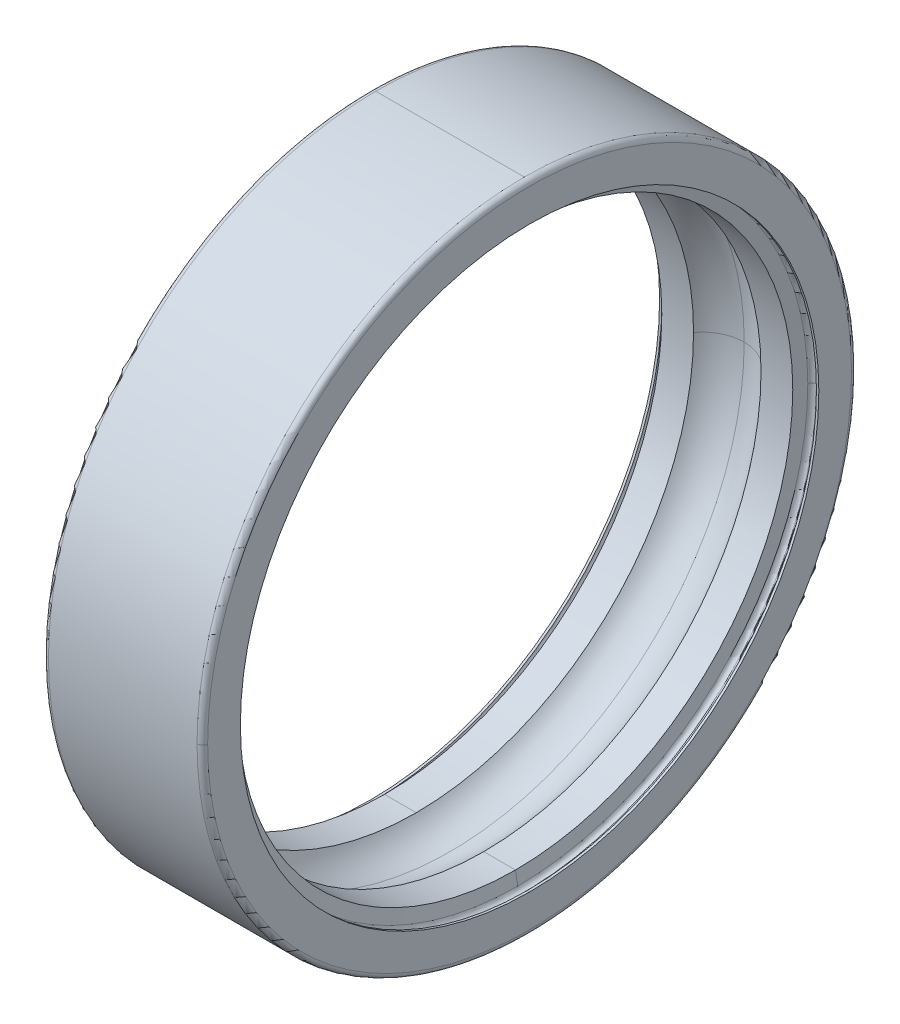
ISO-10303-21;
HEADER;
FILE_DESCRIPTION(('STEP AP214'),'2;1');
FILE_NAME('part.step','',(''),(''),'','','');
FILE_SCHEMA(('AUTOMOTIVE_DESIGN { 1 0 10303 214 1 1 1 1 }'));
ENDSEC;
DATA;
#1=APPLICATION_CONTEXT('core data for automotive mechanical design processes');
#2=APPLICATION_PROTOCOL_DEFINITION('international standard','automotive_design',2000,#1);
#3=PRODUCT_CONTEXT('',#1,'mechanical');
#4=PRODUCT('Part','Part','',(#3));
#5=PRODUCT_RELATED_PRODUCT_CATEGORY('part','',(#4));
#6=PRODUCT_DEFINITION_FORMATION('','',#4);
#7=PRODUCT_DEFINITION_CONTEXT('part definition',#1,'design');
#8=PRODUCT_DEFINITION('design','',#6,#7);
#9=PRODUCT_DEFINITION_SHAPE('','',#8);
#10=(LENGTH_UNIT() NAMED_UNIT(*) SI_UNIT(.MILLI.,.METRE.));
#11=(NAMED_UNIT(*) PLANE_ANGLE_UNIT() SI_UNIT($,.RADIAN.));
#12=(NAMED_UNIT(*) SI_UNIT($,.STERADIAN.) SOLID_ANGLE_UNIT());
#13=UNCERTAINTY_MEASURE_WITH_UNIT(LENGTH_MEASURE(1.E-05),#10,'distance_accuracy_value','');
#14=(GEOMETRIC_REPRESENTATION_CONTEXT(3) GLOBAL_UNCERTAINTY_ASSIGNED_CONTEXT((#13)) GLOBAL_UNIT_ASSIGNED_CONTEXT((#10,
#11,#12)) REPRESENTATION_CONTEXT('',''));
#15=CARTESIAN_POINT('',(0.,0.,0.));
#16=DIRECTION('',(0.,0.,1.));
#17=DIRECTION('',(1.,0.,0.));
#18=AXIS2_PLACEMENT_3D('',#15,#16,#17);
#19=CARTESIAN_POINT('',(8.595,0.,0.));
#20=DIRECTION('',(1.,0.,0.));
#21=DIRECTION('',(0.,0.,-1.));
#22=AXIS2_PLACEMENT_3D('',#19,#20,#21);
#23=TOROIDAL_SURFACE('',#22,16.35,0.27);
#24=CARTESIAN_POINT('',(8.595,0.,0.));
#25=DIRECTION('',(1.,0.,0.));
#26=DIRECTION('',(0.,0.,1.));
#27=AXIS2_PLACEMENT_3D('',#24,#25,#26);
#28=CIRCLE('',#27,16.62);
#29=CARTESIAN_POINT('',(8.595,0.,-16.62));
#30=VERTEX_POINT('',#29);
#31=CARTESIAN_POINT('',(8.595,0.,16.62));
#32=VERTEX_POINT('',#31);
#33=EDGE_CURVE('E445',#30,#32,#28,.T.);
#34=ORIENTED_EDGE('',*,*,#33,.T.);
#35=CARTESIAN_POINT('',(8.595,0.,16.35));
#36=DIRECTION('',(0.,-1.,0.));
#37=DIRECTION('',(0.,0.,1.));
#38=AXIS2_PLACEMENT_3D('',#35,#36,#37);
#39=CIRCLE('',#38,0.27);
#40=CARTESIAN_POINT('',(8.3291019066867,0.,16.3968850079701));
#41=VERTEX_POINT('',#40);
#42=EDGE_CURVE('E342',#32,#41,#39,.T.);
#43=ORIENTED_EDGE('',*,*,#42,.T.);
#44=CARTESIAN_POINT('',(8.3291019066867,0.,0.));
#45=DIRECTION('',(1.,0.,0.));
#46=DIRECTION('',(0.,1.,0.));
#47=AXIS2_PLACEMENT_3D('',#44,#45,#46);
#48=CIRCLE('',#47,16.3968850079701);
#49=CARTESIAN_POINT('',(8.3291019066867,16.3968850079701,0.));
#50=VERTEX_POINT('',#49);
#51=EDGE_CURVE('E32',#50,#41,#48,.T.);
#52=ORIENTED_EDGE('',*,*,#51,.F.);
#53=CARTESIAN_POINT('',(8.3291019066867,0.,0.));
#54=DIRECTION('',(1.,0.,0.));
#55=DIRECTION('',(0.,1.,0.));
#56=AXIS2_PLACEMENT_3D('',#53,#54,#55);
#57=CIRCLE('',#56,16.3968850079701);
#58=CARTESIAN_POINT('',(8.3291019066867,0.,-16.3968850079701));
#59=VERTEX_POINT('',#58);
#60=EDGE_CURVE('E188',#59,#50,#57,.T.);
#61=ORIENTED_EDGE('',*,*,#60,.F.);
#62=CARTESIAN_POINT('',(8.595,0.,-16.35));
#63=DIRECTION('',(0.,-1.,0.));
#64=DIRECTION('',(0.,0.,-1.));
#65=AXIS2_PLACEMENT_3D('',#62,#63,#64);
#66=CIRCLE('',#65,0.27);
#67=EDGE_CURVE('E328',#59,#30,#66,.T.);
#68=ORIENTED_EDGE('',*,*,#67,.T.);
#69=EDGE_LOOP('',(#34,#43,#52,#61,#68));
#70=FACE_BOUND('',#69,.T.);
#71=ADVANCED_FACE('F17',(#70),#23,.F.);
#72=CARTESIAN_POINT('',(8.9325,0.,0.));
#73=DIRECTION('',(1.,0.,0.));
#74=DIRECTION('',(0.,1.,0.));
#75=AXIS2_PLACEMENT_3D('',#72,#73,#74);
#76=CYLINDRICAL_SURFACE('',#75,16.35);
#77=DIRECTION('',(1.,0.,0.));
#78=VECTOR('',#77,1.);
#79=CARTESIAN_POINT('',(8.9325,16.35,0.));
#80=LINE('',#79,#78);
#81=CARTESIAN_POINT('',(8.865,16.35,0.));
#82=VERTEX_POINT('',#81);
#83=CARTESIAN_POINT('',(9.,16.35,0.));
#84=VERTEX_POINT('',#83);
#85=EDGE_CURVE('E344',#82,#84,#80,.T.);
#86=ORIENTED_EDGE('',*,*,#85,.T.);
#87=CARTESIAN_POINT('',(9.,0.,0.));
#88=DIRECTION('',(1.,0.,0.));
#89=DIRECTION('',(0.,1.,0.));
#90=AXIS2_PLACEMENT_3D('',#87,#88,#89);
#91=CIRCLE('',#90,16.35);
#92=CARTESIAN_POINT('',(9.,-16.35,0.));
#93=VERTEX_POINT('',#92);
#94=EDGE_CURVE('E11',#84,#93,#91,.T.);
#95=ORIENTED_EDGE('',*,*,#94,.T.);
#96=DIRECTION('',(-1.,0.,0.));
#97=VECTOR('',#96,1.);
#98=CARTESIAN_POINT('',(8.9325,-16.35,0.));
#99=LINE('',#98,#97);
#100=CARTESIAN_POINT('',(8.865,-16.35,0.));
#101=VERTEX_POINT('',#100);
#102=EDGE_CURVE('E225',#93,#101,#99,.T.);
#103=ORIENTED_EDGE('',*,*,#102,.T.);
#104=CARTESIAN_POINT('',(8.865,0.,0.));
#105=DIRECTION('',(1.,0.,0.));
#106=DIRECTION('',(0.,1.,0.));
#107=AXIS2_PLACEMENT_3D('',#104,#105,#106);
#108=CIRCLE('',#107,16.35);
#109=CARTESIAN_POINT('',(8.865,0.,16.35));
#110=VERTEX_POINT('',#109);
#111=EDGE_CURVE('E322',#110,#101,#108,.T.);
#112=ORIENTED_EDGE('',*,*,#111,.F.);
#113=CARTESIAN_POINT('',(8.865,0.,0.));
#114=DIRECTION('',(1.,0.,0.));
#115=DIRECTION('',(0.,1.,0.));
#116=AXIS2_PLACEMENT_3D('',#113,#114,#115);
#117=CIRCLE('',#116,16.35);
#118=EDGE_CURVE('E378',#82,#110,#117,.T.);
#119=ORIENTED_EDGE('',*,*,#118,.F.);
#120=EDGE_LOOP('',(#86,#95,#103,#112,#119));
#121=FACE_BOUND('',#120,.T.);
#122=ADVANCED_FACE('F19',(#121),#76,.F.);
#123=CARTESIAN_POINT('',(9.,17.275,0.));
#124=DIRECTION('',(1.,0.,0.));
#125=DIRECTION('',(0.,1.,0.));
#126=AXIS2_PLACEMENT_3D('',#123,#124,#125);
#127=PLANE('',#126);
#128=ORIENTED_EDGE('',*,*,#94,.F.);
#129=CARTESIAN_POINT('',(9.,0.,0.));
#130=DIRECTION('',(1.,0.,0.));
#131=DIRECTION('',(0.,1.,0.));
#132=AXIS2_PLACEMENT_3D('',#129,#130,#131);
#133=CIRCLE('',#132,16.35);
#134=EDGE_CURVE('E220',#93,#84,#133,.T.);
#135=ORIENTED_EDGE('',*,*,#134,.F.);
#136=EDGE_LOOP('',(#128,#135));
#137=FACE_BOUND('',#136,.T.);
#138=CARTESIAN_POINT('',(9.,0.,0.));
#139=DIRECTION('',(1.,0.,0.));
#140=DIRECTION('',(0.,1.,0.));
#141=AXIS2_PLACEMENT_3D('',#138,#139,#140);
#142=CIRCLE('',#141,18.2);
#143=CARTESIAN_POINT('',(9.,0.,18.2));
#144=VERTEX_POINT('',#143);
#145=CARTESIAN_POINT('',(9.,0.,-18.2));
#146=VERTEX_POINT('',#145);
#147=EDGE_CURVE('E25',#144,#146,#142,.T.);
#148=ORIENTED_EDGE('',*,*,#147,.T.);
#149=CARTESIAN_POINT('',(9.,0.,0.));
#150=DIRECTION('',(1.,0.,0.));
#151=DIRECTION('',(0.,1.,0.));
#152=AXIS2_PLACEMENT_3D('',#149,#150,#151);
#153=CIRCLE('',#152,18.2);
#154=EDGE_CURVE('E200',#146,#144,#153,.T.);
#155=ORIENTED_EDGE('',*,*,#154,.T.);
#156=EDGE_LOOP('',(#148,#155));
#157=FACE_BOUND('',#156,.T.);
#158=ADVANCED_FACE('F199',(#137,#157),#127,.T.);
#159=CARTESIAN_POINT('',(8.7,0.,0.));
#160=DIRECTION('',(1.,0.,0.));
#161=DIRECTION('',(0.,0.,-1.));
#162=AXIS2_PLACEMENT_3D('',#159,#160,#161);
#163=TOROIDAL_SURFACE('',#162,18.2,0.3);
#164=CARTESIAN_POINT('',(8.7,0.,-18.2));
#165=DIRECTION('',(0.,-1.,0.));
#166=DIRECTION('',(0.,0.,-1.));
#167=AXIS2_PLACEMENT_3D('',#164,#165,#166);
#168=CIRCLE('',#167,0.3);
#169=CARTESIAN_POINT('',(8.7,0.,-18.5));
#170=VERTEX_POINT('',#169);
#171=EDGE_CURVE('E211',#170,#146,#168,.T.);
#172=ORIENTED_EDGE('',*,*,#171,.T.);
#173=ORIENTED_EDGE('',*,*,#147,.F.);
#174=CARTESIAN_POINT('',(8.7,0.,18.2));
#175=DIRECTION('',(0.,-1.,0.));
#176=DIRECTION('',(0.,0.,1.));
#177=AXIS2_PLACEMENT_3D('',#174,#175,#176);
#178=CIRCLE('',#177,0.3);
#179=CARTESIAN_POINT('',(8.7,0.,18.5));
#180=VERTEX_POINT('',#179);
#181=EDGE_CURVE('E213',#144,#180,#178,.T.);
#182=ORIENTED_EDGE('',*,*,#181,.T.);
#183=CARTESIAN_POINT('',(8.7,0.,0.));
#184=DIRECTION('',(1.,0.,0.));
#185=DIRECTION('',(0.,1.,0.));
#186=AXIS2_PLACEMENT_3D('',#183,#184,#185);
#187=CIRCLE('',#186,18.5);
#188=CARTESIAN_POINT('',(8.7,-18.5,0.));
#189=VERTEX_POINT('',#188);
#190=EDGE_CURVE('E233',#180,#189,#187,.T.);
#191=ORIENTED_EDGE('',*,*,#190,.T.);
#192=CARTESIAN_POINT('',(8.7,0.,0.));
#193=DIRECTION('',(1.,0.,0.));
#194=DIRECTION('',(0.,1.,0.));
#195=AXIS2_PLACEMENT_3D('',#192,#193,#194);
#196=CIRCLE('',#195,18.5);
#197=EDGE_CURVE('E193',#189,#170,#196,.T.);
#198=ORIENTED_EDGE('',*,*,#197,.T.);
#199=EDGE_LOOP('',(#172,#173,#182,#191,#198));
#200=FACE_BOUND('',#199,.T.);
#201=ADVANCED_FACE('F216',(#200),#163,.T.);
#202=CARTESIAN_POINT('',(4.5,0.,0.));
#203=DIRECTION('',(1.,0.,0.));
#204=DIRECTION('',(0.,1.,0.));
#205=AXIS2_PLACEMENT_3D('',#202,#203,#204);
#206=CYLINDRICAL_SURFACE('',#205,18.5);
#207=DIRECTION('',(1.,0.,0.));
#208=VECTOR('',#207,1.);
#209=CARTESIAN_POINT('',(4.5,18.5,0.));
#210=LINE('',#209,#208);
#211=CARTESIAN_POINT('',(0.3,18.5,0.));
#212=VERTEX_POINT('',#211);
#213=CARTESIAN_POINT('',(8.7,18.5,0.));
#214=VERTEX_POINT('',#213);
#215=EDGE_CURVE('E214',#212,#214,#210,.T.);
#216=ORIENTED_EDGE('',*,*,#215,.T.);
#217=CARTESIAN_POINT('',(8.7,0.,0.));
#218=DIRECTION('',(1.,0.,0.));
#219=DIRECTION('',(0.,1.,0.));
#220=AXIS2_PLACEMENT_3D('',#217,#218,#219);
#221=CIRCLE('',#220,18.5);
#222=EDGE_CURVE('E219',#170,#214,#221,.T.);
#223=ORIENTED_EDGE('',*,*,#222,.F.);
#224=ORIENTED_EDGE('',*,*,#197,.F.);
#225=DIRECTION('',(-1.,0.,0.));
#226=VECTOR('',#225,1.);
#227=CARTESIAN_POINT('',(4.5,-18.5,0.));
#228=LINE('',#227,#226);
#229=CARTESIAN_POINT('',(0.3,-18.5,0.));
#230=VERTEX_POINT('',#229);
#231=EDGE_CURVE('E455',#189,#230,#228,.T.);
#232=ORIENTED_EDGE('',*,*,#231,.T.);
#233=CARTESIAN_POINT('',(0.3,0.,0.));
#234=DIRECTION('',(1.,0.,0.));
#235=DIRECTION('',(0.,1.,0.));
#236=AXIS2_PLACEMENT_3D('',#233,#234,#235);
#237=CIRCLE('',#236,18.5);
#238=CARTESIAN_POINT('',(0.3,0.,-18.5));
#239=VERTEX_POINT('',#238);
#240=EDGE_CURVE('E191',#230,#239,#237,.T.);
#241=ORIENTED_EDGE('',*,*,#240,.T.);
#242=CARTESIAN_POINT('',(0.3,0.,0.));
#243=DIRECTION('',(1.,0.,0.));
#244=DIRECTION('',(0.,1.,0.));
#245=AXIS2_PLACEMENT_3D('',#242,#243,#244);
#246=CIRCLE('',#245,18.5);
#247=EDGE_CURVE('E241',#239,#212,#246,.T.);
#248=ORIENTED_EDGE('',*,*,#247,.T.);
#249=EDGE_LOOP('',(#216,#223,#224,#232,#241,#248));
#250=FACE_BOUND('',#249,.T.);
#251=ADVANCED_FACE('F472',(#250),#206,.T.);
#252=CARTESIAN_POINT('',(0.3,0.,0.));
#253=DIRECTION('',(1.,0.,0.));
#254=DIRECTION('',(0.,0.,-1.));
#255=AXIS2_PLACEMENT_3D('',#252,#253,#254);
#256=TOROIDAL_SURFACE('',#255,18.2,0.3);
#257=CARTESIAN_POINT('',(0.3,0.,-18.2));
#258=DIRECTION('',(0.,-1.,0.));
#259=DIRECTION('',(0.,0.,-1.));
#260=AXIS2_PLACEMENT_3D('',#257,#258,#259);
#261=CIRCLE('',#260,0.3);
#262=CARTESIAN_POINT('',(0.,0.,-18.2));
#263=VERTEX_POINT('',#262);
#264=EDGE_CURVE('E229',#263,#239,#261,.T.);
#265=ORIENTED_EDGE('',*,*,#264,.T.);
#266=ORIENTED_EDGE('',*,*,#240,.F.);
#267=CARTESIAN_POINT('',(0.3,0.,0.));
#268=DIRECTION('',(1.,0.,0.));
#269=DIRECTION('',(0.,1.,0.));
#270=AXIS2_PLACEMENT_3D('',#267,#268,#269);
#271=CIRCLE('',#270,18.5);
#272=CARTESIAN_POINT('',(0.3,0.,18.5));
#273=VERTEX_POINT('',#272);
#274=EDGE_CURVE('E389',#273,#230,#271,.T.);
#275=ORIENTED_EDGE('',*,*,#274,.F.);
#276=CARTESIAN_POINT('',(0.3,0.,18.2));
#277=DIRECTION('',(0.,-1.,0.));
#278=DIRECTION('',(0.,0.,1.));
#279=AXIS2_PLACEMENT_3D('',#276,#277,#278);
#280=CIRCLE('',#279,0.3);
#281=CARTESIAN_POINT('',(0.,0.,18.2));
#282=VERTEX_POINT('',#281);
#283=EDGE_CURVE('E238',#273,#282,#280,.T.);
#284=ORIENTED_EDGE('',*,*,#283,.T.);
#285=CARTESIAN_POINT('',(0.,0.,0.));
#286=DIRECTION('',(1.,0.,0.));
#287=DIRECTION('',(0.,1.,0.));
#288=AXIS2_PLACEMENT_3D('',#285,#286,#287);
#289=CIRCLE('',#288,18.2);
#290=EDGE_CURVE('E194',#282,#263,#289,.T.);
#291=ORIENTED_EDGE('',*,*,#290,.T.);
#292=EDGE_LOOP('',(#265,#266,#275,#284,#291));
#293=FACE_BOUND('',#292,.T.);
#294=ADVANCED_FACE('F468',(#293),#256,.T.);
#295=CARTESIAN_POINT('',(0.,17.275,0.));
#296=DIRECTION('',(-1.,0.,0.));
#297=DIRECTION('',(0.,0.,1.));
#298=AXIS2_PLACEMENT_3D('',#295,#296,#297);
#299=PLANE('',#298);
#300=CARTESIAN_POINT('',(0.,0.,0.));
#301=DIRECTION('',(1.,0.,0.));
#302=DIRECTION('',(0.,1.,0.));
#303=AXIS2_PLACEMENT_3D('',#300,#301,#302);
#304=CIRCLE('',#303,16.35);
#305=CARTESIAN_POINT('',(0.,16.35,0.));
#306=VERTEX_POINT('',#305);
#307=CARTESIAN_POINT('',(0.,-16.35,0.));
#308=VERTEX_POINT('',#307);
#309=EDGE_CURVE('E243',#306,#308,#304,.T.);
#310=ORIENTED_EDGE('',*,*,#309,.T.);
#311=CARTESIAN_POINT('',(0.,0.,0.));
#312=DIRECTION('',(1.,0.,0.));
#313=DIRECTION('',(0.,1.,0.));
#314=AXIS2_PLACEMENT_3D('',#311,#312,#313);
#315=CIRCLE('',#314,16.35);
#316=EDGE_CURVE('E249',#308,#306,#315,.T.);
#317=ORIENTED_EDGE('',*,*,#316,.T.);
#318=EDGE_LOOP('',(#310,#317));
#319=FACE_BOUND('',#318,.T.);
#320=CARTESIAN_POINT('',(0.,0.,0.));
#321=DIRECTION('',(1.,0.,0.));
#322=DIRECTION('',(0.,1.,0.));
#323=AXIS2_PLACEMENT_3D('',#320,#321,#322);
#324=CIRCLE('',#323,18.2);
#325=EDGE_CURVE('E232',#263,#282,#324,.T.);
#326=ORIENTED_EDGE('',*,*,#325,.F.);
#327=ORIENTED_EDGE('',*,*,#290,.F.);
#328=EDGE_LOOP('',(#326,#327));
#329=FACE_BOUND('',#328,.T.);
#330=ADVANCED_FACE('F478',(#319,#329),#299,.T.);
#331=CARTESIAN_POINT('',(0.067499999999999,0.,0.));
#332=DIRECTION('',(1.,0.,0.));
#333=DIRECTION('',(0.,1.,0.));
#334=AXIS2_PLACEMENT_3D('',#331,#332,#333);
#335=CYLINDRICAL_SURFACE('',#334,16.35);
#336=DIRECTION('',(1.,0.,0.));
#337=VECTOR('',#336,1.);
#338=CARTESIAN_POINT('',(0.067499999999999,16.35,0.));
#339=LINE('',#338,#337);
#340=CARTESIAN_POINT('',(0.135,16.35,0.));
#341=VERTEX_POINT('',#340);
#342=EDGE_CURVE('E245',#306,#341,#339,.T.);
#343=ORIENTED_EDGE('',*,*,#342,.T.);
#344=CARTESIAN_POINT('',(0.135,0.,0.));
#345=DIRECTION('',(1.,0.,0.));
#346=DIRECTION('',(0.,1.,0.));
#347=AXIS2_PLACEMENT_3D('',#344,#345,#346);
#348=CIRCLE('',#347,16.35);
#349=CARTESIAN_POINT('',(0.135,0.,16.35));
#350=VERTEX_POINT('',#349);
#351=EDGE_CURVE('E235',#341,#350,#348,.T.);
#352=ORIENTED_EDGE('',*,*,#351,.T.);
#353=CARTESIAN_POINT('',(0.135,0.,0.));
#354=DIRECTION('',(1.,0.,0.));
#355=DIRECTION('',(0.,1.,0.));
#356=AXIS2_PLACEMENT_3D('',#353,#354,#355);
#357=CIRCLE('',#356,16.35);
#358=CARTESIAN_POINT('',(0.135,-16.35,0.));
#359=VERTEX_POINT('',#358);
#360=EDGE_CURVE('E260',#350,#359,#357,.T.);
#361=ORIENTED_EDGE('',*,*,#360,.T.);
#362=DIRECTION('',(-1.,0.,0.));
#363=VECTOR('',#362,1.);
#364=CARTESIAN_POINT('',(0.067499999999999,-16.35,0.));
#365=LINE('',#364,#363);
#366=EDGE_CURVE('E254',#359,#308,#365,.T.);
#367=ORIENTED_EDGE('',*,*,#366,.T.);
#368=ORIENTED_EDGE('',*,*,#309,.F.);
#369=EDGE_LOOP('',(#343,#352,#361,#367,#368));
#370=FACE_BOUND('',#369,.T.);
#371=ADVANCED_FACE('F480',(#370),#335,.F.);
#372=CARTESIAN_POINT('',(0.405,0.,0.));
#373=DIRECTION('',(1.,0.,0.));
#374=DIRECTION('',(0.,0.,-1.));
#375=AXIS2_PLACEMENT_3D('',#372,#373,#374);
#376=TOROIDAL_SURFACE('',#375,16.35,0.27);
#377=CARTESIAN_POINT('',(0.405,0.,0.));
#378=DIRECTION('',(1.,0.,0.));
#379=DIRECTION('',(0.,0.,1.));
#380=AXIS2_PLACEMENT_3D('',#377,#378,#379);
#381=CIRCLE('',#380,16.62);
#382=CARTESIAN_POINT('',(0.405,0.,-16.62));
#383=VERTEX_POINT('',#382);
#384=CARTESIAN_POINT('',(0.405,0.,16.62));
#385=VERTEX_POINT('',#384);
#386=EDGE_CURVE('E377',#383,#385,#381,.T.);
#387=ORIENTED_EDGE('',*,*,#386,.T.);
#388=CARTESIAN_POINT('',(0.405,0.,16.35));
#389=DIRECTION('',(0.,-1.,0.));
#390=DIRECTION('',(0.,0.,1.));
#391=AXIS2_PLACEMENT_3D('',#388,#389,#390);
#392=CIRCLE('',#391,0.27);
#393=EDGE_CURVE('E261',#385,#350,#392,.T.);
#394=ORIENTED_EDGE('',*,*,#393,.T.);
#395=ORIENTED_EDGE('',*,*,#351,.F.);
#396=CARTESIAN_POINT('',(0.135,0.,0.));
#397=DIRECTION('',(1.,0.,0.));
#398=DIRECTION('',(0.,1.,0.));
#399=AXIS2_PLACEMENT_3D('',#396,#397,#398);
#400=CIRCLE('',#399,16.35);
#401=CARTESIAN_POINT('',(0.135,0.,-16.35));
#402=VERTEX_POINT('',#401);
#403=EDGE_CURVE('E253',#402,#341,#400,.T.);
#404=ORIENTED_EDGE('',*,*,#403,.F.);
#405=CARTESIAN_POINT('',(0.405,0.,-16.35));
#406=DIRECTION('',(0.,-1.,0.));
#407=DIRECTION('',(0.,0.,-1.));
#408=AXIS2_PLACEMENT_3D('',#405,#406,#407);
#409=CIRCLE('',#408,0.27);
#410=EDGE_CURVE('E257',#402,#383,#409,.T.);
#411=ORIENTED_EDGE('',*,*,#410,.T.);
#412=EDGE_LOOP('',(#387,#394,#395,#404,#411));
#413=FACE_BOUND('',#412,.T.);
#414=ADVANCED_FACE('F488',(#413),#376,.F.);
#415=CARTESIAN_POINT('',(0.734541995250332,0.,0.));
#416=DIRECTION('',(-1.,0.,0.));
#417=DIRECTION('',(0.,1.,0.));
#418=AXIS2_PLACEMENT_3D('',#415,#416,#417);
#419=CONICAL_SURFACE('',#418,16.035942503985,1.39626340159546);
#420=DIRECTION('',(0.17364817766693,-0.984807753012208,0.));
#421=VECTOR('',#420,1.);
#422=CARTESIAN_POINT('',(0.734541995250332,16.035942503985,0.));
#423=LINE('',#422,#421);
#424=CARTESIAN_POINT('',(0.670898093313297,16.3968850079701,0.));
#425=VERTEX_POINT('',#424);
#426=CARTESIAN_POINT('',(0.798185897187366,15.675,0.));
#427=VERTEX_POINT('',#426);
#428=EDGE_CURVE('E264',#425,#427,#423,.T.);
#429=ORIENTED_EDGE('',*,*,#428,.T.);
#430=CARTESIAN_POINT('',(0.798185897187366,0.,0.));
#431=DIRECTION('',(1.,0.,0.));
#432=DIRECTION('',(0.,1.,0.));
#433=AXIS2_PLACEMENT_3D('',#430,#431,#432);
#434=CIRCLE('',#433,15.675);
#435=CARTESIAN_POINT('',(0.798185897187366,-15.675,0.));
#436=VERTEX_POINT('',#435);
#437=EDGE_CURVE('E155',#427,#436,#434,.T.);
#438=ORIENTED_EDGE('',*,*,#437,.T.);
#439=DIRECTION('',(-0.17364817766693,-0.984807753012208,0.));
#440=VECTOR('',#439,1.);
#441=CARTESIAN_POINT('',(0.734541995250332,-16.035942503985,0.));
#442=LINE('',#441,#440);
#443=CARTESIAN_POINT('',(0.670898093313296,-16.3968850079701,0.));
#444=VERTEX_POINT('',#443);
#445=EDGE_CURVE('E267',#436,#444,#442,.T.);
#446=ORIENTED_EDGE('',*,*,#445,.T.);
#447=CARTESIAN_POINT('',(0.670898093313296,0.,0.));
#448=DIRECTION('',(1.,0.,0.));
#449=DIRECTION('',(0.,1.,0.));
#450=AXIS2_PLACEMENT_3D('',#447,#448,#449);
#451=CIRCLE('',#450,16.3968850079701);
#452=CARTESIAN_POINT('',(0.670898093313296,0.,16.3968850079701));
#453=VERTEX_POINT('',#452);
#454=EDGE_CURVE('E311',#453,#444,#451,.T.);
#455=ORIENTED_EDGE('',*,*,#454,.F.);
#456=CARTESIAN_POINT('',(0.670898093313296,0.,0.));
#457=DIRECTION('',(1.,0.,0.));
#458=DIRECTION('',(0.,1.,0.));
#459=AXIS2_PLACEMENT_3D('',#456,#457,#458);
#460=CIRCLE('',#459,16.3968850079701);
#461=EDGE_CURVE('E301',#425,#453,#460,.T.);
#462=ORIENTED_EDGE('',*,*,#461,.F.);
#463=EDGE_LOOP('',(#429,#438,#446,#455,#462));
#464=FACE_BOUND('',#463,.T.);
#465=ADVANCED_FACE('F410',(#464),#419,.F.);
#466=CARTESIAN_POINT('',(1.69534560259476,0.,0.));
#467=DIRECTION('',(1.,0.,0.));
#468=DIRECTION('',(0.,1.,0.));
#469=AXIS2_PLACEMENT_3D('',#466,#467,#468);
#470=CYLINDRICAL_SURFACE('',#469,15.675);
#471=DIRECTION('',(1.,0.,0.));
#472=VECTOR('',#471,1.);
#473=CARTESIAN_POINT('',(1.69534560259476,15.675,0.));
#474=LINE('',#473,#472);
#475=CARTESIAN_POINT('',(2.59250530800214,15.675,0.));
#476=VERTEX_POINT('',#475);
#477=EDGE_CURVE('E151',#427,#476,#474,.T.);
#478=ORIENTED_EDGE('',*,*,#477,.T.);
#479=CARTESIAN_POINT('',(2.59250530800214,0.,0.));
#480=DIRECTION('',(1.,0.,0.));
#481=DIRECTION('',(0.,1.,0.));
#482=AXIS2_PLACEMENT_3D('',#479,#480,#481);
#483=CIRCLE('',#482,15.675);
#484=CARTESIAN_POINT('',(2.59250530800214,0.,15.675));
#485=VERTEX_POINT('',#484);
#486=EDGE_CURVE('E143',#476,#485,#483,.T.);
#487=ORIENTED_EDGE('',*,*,#486,.T.);
#488=CARTESIAN_POINT('',(2.59250530800214,0.,0.));
#489=DIRECTION('',(1.,0.,0.));
#490=DIRECTION('',(0.,1.,0.));
#491=AXIS2_PLACEMENT_3D('',#488,#489,#490);
#492=CIRCLE('',#491,15.675);
#493=CARTESIAN_POINT('',(2.59250530800214,-15.675,0.));
#494=VERTEX_POINT('',#493);
#495=EDGE_CURVE('E148',#485,#494,#492,.T.);
#496=ORIENTED_EDGE('',*,*,#495,.T.);
#497=DIRECTION('',(-1.,0.,0.));
#498=VECTOR('',#497,1.);
#499=CARTESIAN_POINT('',(1.69534560259476,-15.675,0.));
#500=LINE('',#499,#498);
#501=EDGE_CURVE('E269',#494,#436,#500,.T.);
#502=ORIENTED_EDGE('',*,*,#501,.T.);
#503=ORIENTED_EDGE('',*,*,#437,.F.);
#504=EDGE_LOOP('',(#478,#487,#496,#502,#503));
#505=FACE_BOUND('',#504,.T.);
#506=ADVANCED_FACE('F145',(#505),#470,.F.);
#507=CARTESIAN_POINT('',(4.5,0.,0.));
#508=DIRECTION('',(1.,0.,0.));
#509=DIRECTION('',(0.,0.,-1.));
#510=AXIS2_PLACEMENT_3D('',#507,#508,#509);
#511=TOROIDAL_SURFACE('',#510,14.25,2.381);
#512=CARTESIAN_POINT('',(4.5,0.,0.));
#513=DIRECTION('',(1.,0.,0.));
#514=DIRECTION('',(0.,0.,1.));
#515=AXIS2_PLACEMENT_3D('',#512,#513,#514);
#516=CIRCLE('',#515,16.631);
#517=CARTESIAN_POINT('',(4.5,0.,-16.631));
#518=VERTEX_POINT('',#517);
#519=CARTESIAN_POINT('',(4.5,0.,16.631));
#520=VERTEX_POINT('',#519);
#521=EDGE_CURVE('E162',#518,#520,#516,.T.);
#522=ORIENTED_EDGE('',*,*,#521,.T.);
#523=CARTESIAN_POINT('',(4.5,0.,14.25));
#524=DIRECTION('',(0.,-1.,0.));
#525=DIRECTION('',(0.,0.,1.));
#526=AXIS2_PLACEMENT_3D('',#523,#524,#525);
#527=CIRCLE('',#526,2.381);
#528=EDGE_CURVE('E159',#520,#485,#527,.T.);
#529=ORIENTED_EDGE('',*,*,#528,.T.);
#530=ORIENTED_EDGE('',*,*,#486,.F.);
#531=CARTESIAN_POINT('',(2.59250530800214,0.,0.));
#532=DIRECTION('',(1.,0.,0.));
#533=DIRECTION('',(0.,1.,0.));
#534=AXIS2_PLACEMENT_3D('',#531,#532,#533);
#535=CIRCLE('',#534,15.675);
#536=CARTESIAN_POINT('',(2.59250530800214,0.,-15.675));
#537=VERTEX_POINT('',#536);
#538=EDGE_CURVE('E174',#537,#476,#535,.T.);
#539=ORIENTED_EDGE('',*,*,#538,.F.);
#540=CARTESIAN_POINT('',(4.5,0.,-14.25));
#541=DIRECTION('',(0.,-1.,0.));
#542=DIRECTION('',(0.,0.,-1.));
#543=AXIS2_PLACEMENT_3D('',#540,#541,#542);
#544=CIRCLE('',#543,2.381);
#545=EDGE_CURVE('E172',#537,#518,#544,.T.);
#546=ORIENTED_EDGE('',*,*,#545,.T.);
#547=EDGE_LOOP('',(#522,#529,#530,#539,#546));
#548=FACE_BOUND('',#547,.T.);
#549=ADVANCED_FACE('F160',(#548),#511,.F.);
#550=CARTESIAN_POINT('',(7.30465439740524,0.,0.));
#551=DIRECTION('',(1.,0.,0.));
#552=DIRECTION('',(0.,1.,0.));
#553=AXIS2_PLACEMENT_3D('',#550,#551,#552);
#554=CYLINDRICAL_SURFACE('',#553,15.675);
#555=DIRECTION('',(1.,0.,0.));
#556=VECTOR('',#555,1.);
#557=CARTESIAN_POINT('',(7.30465439740524,15.675,0.));
#558=LINE('',#557,#556);
#559=CARTESIAN_POINT('',(6.40749469199786,15.675,0.));
#560=VERTEX_POINT('',#559);
#561=CARTESIAN_POINT('',(8.20181410281263,15.675,0.));
#562=VERTEX_POINT('',#561);
#563=EDGE_CURVE('E166',#560,#562,#558,.T.);
#564=ORIENTED_EDGE('',*,*,#563,.T.);
#565=CARTESIAN_POINT('',(8.20181410281263,0.,0.));
#566=DIRECTION('',(1.,0.,0.));
#567=DIRECTION('',(0.,1.,0.));
#568=AXIS2_PLACEMENT_3D('',#565,#566,#567);
#569=CIRCLE('',#568,15.675);
#570=CARTESIAN_POINT('',(8.20181410281263,-15.675,0.));
#571=VERTEX_POINT('',#570);
#572=EDGE_CURVE('E41',#562,#571,#569,.T.);
#573=ORIENTED_EDGE('',*,*,#572,.T.);
#574=DIRECTION('',(-1.,0.,0.));
#575=VECTOR('',#574,1.);
#576=CARTESIAN_POINT('',(7.30465439740524,-15.675,0.));
#577=LINE('',#576,#575);
#578=CARTESIAN_POINT('',(6.40749469199785,-15.675,0.));
#579=VERTEX_POINT('',#578);
#580=EDGE_CURVE('E180',#571,#579,#577,.T.);
#581=ORIENTED_EDGE('',*,*,#580,.T.);
#582=CARTESIAN_POINT('',(6.40749469199786,0.,0.));
#583=DIRECTION('',(1.,0.,0.));
#584=DIRECTION('',(0.,1.,0.));
#585=AXIS2_PLACEMENT_3D('',#582,#583,#584);
#586=CIRCLE('',#585,15.675);
#587=CARTESIAN_POINT('',(6.40749469199785,0.,15.675));
#588=VERTEX_POINT('',#587);
#589=EDGE_CURVE('E280',#588,#579,#586,.T.);
#590=ORIENTED_EDGE('',*,*,#589,.F.);
#591=CARTESIAN_POINT('',(6.40749469199786,0.,0.));
#592=DIRECTION('',(1.,0.,0.));
#593=DIRECTION('',(0.,1.,0.));
#594=AXIS2_PLACEMENT_3D('',#591,#592,#593);
#595=CIRCLE('',#594,15.675);
#596=EDGE_CURVE('E454',#560,#588,#595,.T.);
#597=ORIENTED_EDGE('',*,*,#596,.F.);
#598=EDGE_LOOP('',(#564,#573,#581,#590,#597));
#599=FACE_BOUND('',#598,.T.);
#600=ADVANCED_FACE('F516',(#599),#554,.F.);
#601=CARTESIAN_POINT('',(8.26545800474967,0.,0.));
#602=DIRECTION('',(1.,0.,0.));
#603=DIRECTION('',(0.,1.,0.));
#604=AXIS2_PLACEMENT_3D('',#601,#602,#603);
#605=CONICAL_SURFACE('',#604,16.035942503985,1.39626340159546);
#606=DIRECTION('',(0.173648177666929,0.984807753012208,0.));
#607=VECTOR('',#606,1.);
#608=CARTESIAN_POINT('',(8.26545800474967,16.035942503985,0.));
#609=LINE('',#608,#607);
#610=EDGE_CURVE('E183',#562,#50,#609,.T.);
#611=ORIENTED_EDGE('',*,*,#610,.T.);
#612=ORIENTED_EDGE('',*,*,#51,.T.);
#613=CARTESIAN_POINT('',(8.3291019066867,0.,0.));
#614=DIRECTION('',(1.,0.,0.));
#615=DIRECTION('',(0.,1.,0.));
#616=AXIS2_PLACEMENT_3D('',#613,#614,#615);
#617=CIRCLE('',#616,16.3968850079701);
#618=CARTESIAN_POINT('',(8.3291019066867,-16.3968850079701,0.));
#619=VERTEX_POINT('',#618);
#620=EDGE_CURVE('E339',#41,#619,#617,.T.);
#621=ORIENTED_EDGE('',*,*,#620,.T.);
#622=DIRECTION('',(-0.173648177666929,0.984807753012208,0.));
#623=VECTOR('',#622,1.);
#624=CARTESIAN_POINT('',(8.26545800474967,-16.035942503985,0.));
#625=LINE('',#624,#623);
#626=EDGE_CURVE('E186',#619,#571,#625,.T.);
#627=ORIENTED_EDGE('',*,*,#626,.T.);
#628=ORIENTED_EDGE('',*,*,#572,.F.);
#629=EDGE_LOOP('',(#611,#612,#621,#627,#628));
#630=FACE_BOUND('',#629,.T.);
#631=ADVANCED_FACE('F512',(#630),#605,.F.);
#632=CARTESIAN_POINT('',(8.26545800474967,0.,0.));
#633=DIRECTION('',(1.,0.,0.));
#634=DIRECTION('',(0.,1.,0.));
#635=AXIS2_PLACEMENT_3D('',#632,#633,#634);
#636=CONICAL_SURFACE('',#635,16.035942503985,1.39626340159546);
#637=ORIENTED_EDGE('',*,*,#610,.F.);
#638=CARTESIAN_POINT('',(8.20181410281263,0.,0.));
#639=DIRECTION('',(1.,0.,0.));
#640=DIRECTION('',(0.,1.,0.));
#641=AXIS2_PLACEMENT_3D('',#638,#639,#640);
#642=CIRCLE('',#641,15.675);
#643=EDGE_CURVE('E182',#571,#562,#642,.T.);
#644=ORIENTED_EDGE('',*,*,#643,.F.);
#645=ORIENTED_EDGE('',*,*,#626,.F.);
#646=CARTESIAN_POINT('',(8.3291019066867,0.,0.));
#647=DIRECTION('',(1.,0.,0.));
#648=DIRECTION('',(0.,1.,0.));
#649=AXIS2_PLACEMENT_3D('',#646,#647,#648);
#650=CIRCLE('',#649,16.3968850079701);
#651=EDGE_CURVE('E333',#619,#59,#650,.T.);
#652=ORIENTED_EDGE('',*,*,#651,.T.);
#653=ORIENTED_EDGE('',*,*,#60,.T.);
#654=EDGE_LOOP('',(#637,#644,#645,#652,#653));
#655=FACE_BOUND('',#654,.T.);
#656=ADVANCED_FACE('F508',(#655),#636,.F.);
#657=CARTESIAN_POINT('',(7.30465439740524,0.,0.));
#658=DIRECTION('',(1.,0.,0.));
#659=DIRECTION('',(0.,1.,0.));
#660=AXIS2_PLACEMENT_3D('',#657,#658,#659);
#661=CYLINDRICAL_SURFACE('',#660,15.675);
#662=ORIENTED_EDGE('',*,*,#563,.F.);
#663=CARTESIAN_POINT('',(6.40749469199786,0.,0.));
#664=DIRECTION('',(1.,0.,0.));
#665=DIRECTION('',(0.,1.,0.));
#666=AXIS2_PLACEMENT_3D('',#663,#664,#665);
#667=CIRCLE('',#666,15.675);
#668=CARTESIAN_POINT('',(6.40749469199785,0.,-15.675));
#669=VERTEX_POINT('',#668);
#670=EDGE_CURVE('E294',#669,#560,#667,.T.);
#671=ORIENTED_EDGE('',*,*,#670,.F.);
#672=CARTESIAN_POINT('',(6.40749469199786,0.,0.));
#673=DIRECTION('',(1.,0.,0.));
#674=DIRECTION('',(0.,1.,0.));
#675=AXIS2_PLACEMENT_3D('',#672,#673,#674);
#676=CIRCLE('',#675,15.675);
#677=EDGE_CURVE('E290',#579,#669,#676,.T.);
#678=ORIENTED_EDGE('',*,*,#677,.F.);
#679=ORIENTED_EDGE('',*,*,#580,.F.);
#680=ORIENTED_EDGE('',*,*,#643,.T.);
#681=EDGE_LOOP('',(#662,#671,#678,#679,#680));
#682=FACE_BOUND('',#681,.T.);
#683=ADVANCED_FACE('F505',(#682),#661,.F.);
#684=CARTESIAN_POINT('',(4.5,0.,0.));
#685=DIRECTION('',(1.,0.,0.));
#686=DIRECTION('',(0.,0.,-1.));
#687=AXIS2_PLACEMENT_3D('',#684,#685,#686);
#688=TOROIDAL_SURFACE('',#687,14.25,2.381);
#689=CARTESIAN_POINT('',(4.5,0.,0.));
#690=DIRECTION('',(1.,0.,0.));
#691=DIRECTION('',(0.,0.,1.));
#692=AXIS2_PLACEMENT_3D('',#689,#690,#691);
#693=CIRCLE('',#692,16.631);
#694=EDGE_CURVE('E275',#520,#518,#693,.T.);
#695=ORIENTED_EDGE('',*,*,#694,.T.);
#696=ORIENTED_EDGE('',*,*,#545,.F.);
#697=CARTESIAN_POINT('',(2.59250530800214,0.,0.));
#698=DIRECTION('',(1.,0.,0.));
#699=DIRECTION('',(0.,1.,0.));
#700=AXIS2_PLACEMENT_3D('',#697,#698,#699);
#701=CIRCLE('',#700,15.675);
#702=EDGE_CURVE('E170',#494,#537,#701,.T.);
#703=ORIENTED_EDGE('',*,*,#702,.F.);
#704=ORIENTED_EDGE('',*,*,#495,.F.);
#705=ORIENTED_EDGE('',*,*,#528,.F.);
#706=EDGE_LOOP('',(#695,#696,#703,#704,#705));
#707=FACE_BOUND('',#706,.T.);
#708=ADVANCED_FACE('F168',(#707),#688,.F.);
#709=CARTESIAN_POINT('',(1.69534560259476,0.,0.));
#710=DIRECTION('',(1.,0.,0.));
#711=DIRECTION('',(0.,1.,0.));
#712=AXIS2_PLACEMENT_3D('',#709,#710,#711);
#713=CYLINDRICAL_SURFACE('',#712,15.675);
#714=ORIENTED_EDGE('',*,*,#477,.F.);
#715=CARTESIAN_POINT('',(0.798185897187366,0.,0.));
#716=DIRECTION('',(1.,0.,0.));
#717=DIRECTION('',(0.,1.,0.));
#718=AXIS2_PLACEMENT_3D('',#715,#716,#717);
#719=CIRCLE('',#718,15.675);
#720=EDGE_CURVE('E270',#436,#427,#719,.T.);
#721=ORIENTED_EDGE('',*,*,#720,.F.);
#722=ORIENTED_EDGE('',*,*,#501,.F.);
#723=ORIENTED_EDGE('',*,*,#702,.T.);
#724=ORIENTED_EDGE('',*,*,#538,.T.);
#725=EDGE_LOOP('',(#714,#721,#722,#723,#724));
#726=FACE_BOUND('',#725,.T.);
#727=ADVANCED_FACE('F272',(#726),#713,.F.);
#728=CARTESIAN_POINT('',(0.734541995250332,0.,0.));
#729=DIRECTION('',(-1.,0.,0.));
#730=DIRECTION('',(0.,1.,0.));
#731=AXIS2_PLACEMENT_3D('',#728,#729,#730);
#732=CONICAL_SURFACE('',#731,16.035942503985,1.39626340159546);
#733=ORIENTED_EDGE('',*,*,#428,.F.);
#734=CARTESIAN_POINT('',(0.670898093313296,0.,0.));
#735=DIRECTION('',(1.,0.,0.));
#736=DIRECTION('',(0.,1.,0.));
#737=AXIS2_PLACEMENT_3D('',#734,#735,#736);
#738=CIRCLE('',#737,16.3968850079701);
#739=CARTESIAN_POINT('',(0.670898093313296,0.,-16.3968850079701));
#740=VERTEX_POINT('',#739);
#741=EDGE_CURVE('E397',#740,#425,#738,.T.);
#742=ORIENTED_EDGE('',*,*,#741,.F.);
#743=CARTESIAN_POINT('',(0.670898093313296,0.,0.));
#744=DIRECTION('',(1.,0.,0.));
#745=DIRECTION('',(0.,1.,0.));
#746=AXIS2_PLACEMENT_3D('',#743,#744,#745);
#747=CIRCLE('',#746,16.3968850079701);
#748=EDGE_CURVE('E314',#444,#740,#747,.T.);
#749=ORIENTED_EDGE('',*,*,#748,.F.);
#750=ORIENTED_EDGE('',*,*,#445,.F.);
#751=ORIENTED_EDGE('',*,*,#720,.T.);
#752=EDGE_LOOP('',(#733,#742,#749,#750,#751));
#753=FACE_BOUND('',#752,.T.);
#754=ADVANCED_FACE('F501',(#753),#732,.F.);
#755=CARTESIAN_POINT('',(0.405,0.,0.));
#756=DIRECTION('',(1.,0.,0.));
#757=DIRECTION('',(0.,0.,-1.));
#758=AXIS2_PLACEMENT_3D('',#755,#756,#757);
#759=TOROIDAL_SURFACE('',#758,16.35,0.27);
#760=CARTESIAN_POINT('',(0.405,0.,0.));
#761=DIRECTION('',(1.,0.,0.));
#762=DIRECTION('',(0.,0.,1.));
#763=AXIS2_PLACEMENT_3D('',#760,#761,#762);
#764=CIRCLE('',#763,16.62);
#765=EDGE_CURVE('E308',#385,#383,#764,.T.);
#766=ORIENTED_EDGE('',*,*,#765,.T.);
#767=ORIENTED_EDGE('',*,*,#410,.F.);
#768=CARTESIAN_POINT('',(0.135,0.,0.));
#769=DIRECTION('',(1.,0.,0.));
#770=DIRECTION('',(0.,1.,0.));
#771=AXIS2_PLACEMENT_3D('',#768,#769,#770);
#772=CIRCLE('',#771,16.35);
#773=EDGE_CURVE('E250',#359,#402,#772,.T.);
#774=ORIENTED_EDGE('',*,*,#773,.F.);
#775=ORIENTED_EDGE('',*,*,#360,.F.);
#776=ORIENTED_EDGE('',*,*,#393,.F.);
#777=EDGE_LOOP('',(#766,#767,#774,#775,#776));
#778=FACE_BOUND('',#777,.T.);
#779=ADVANCED_FACE('F419',(#778),#759,.F.);
#780=CARTESIAN_POINT('',(0.067499999999999,0.,0.));
#781=DIRECTION('',(1.,0.,0.));
#782=DIRECTION('',(0.,1.,0.));
#783=AXIS2_PLACEMENT_3D('',#780,#781,#782);
#784=CYLINDRICAL_SURFACE('',#783,16.35);
#785=ORIENTED_EDGE('',*,*,#342,.F.);
#786=ORIENTED_EDGE('',*,*,#316,.F.);
#787=ORIENTED_EDGE('',*,*,#366,.F.);
#788=ORIENTED_EDGE('',*,*,#773,.T.);
#789=ORIENTED_EDGE('',*,*,#403,.T.);
#790=EDGE_LOOP('',(#785,#786,#787,#788,#789));
#791=FACE_BOUND('',#790,.T.);
#792=ADVANCED_FACE('F500',(#791),#784,.F.);
#793=CARTESIAN_POINT('',(0.3,0.,0.));
#794=DIRECTION('',(1.,0.,0.));
#795=DIRECTION('',(0.,0.,-1.));
#796=AXIS2_PLACEMENT_3D('',#793,#794,#795);
#797=TOROIDAL_SURFACE('',#796,18.2,0.3);
#798=ORIENTED_EDGE('',*,*,#264,.F.);
#799=ORIENTED_EDGE('',*,*,#325,.T.);
#800=ORIENTED_EDGE('',*,*,#283,.F.);
#801=CARTESIAN_POINT('',(0.3,0.,0.));
#802=DIRECTION('',(1.,0.,0.));
#803=DIRECTION('',(0.,1.,0.));
#804=AXIS2_PLACEMENT_3D('',#801,#802,#803);
#805=CIRCLE('',#804,18.5);
#806=EDGE_CURVE('E317',#212,#273,#805,.T.);
#807=ORIENTED_EDGE('',*,*,#806,.F.);
#808=ORIENTED_EDGE('',*,*,#247,.F.);
#809=EDGE_LOOP('',(#798,#799,#800,#807,#808));
#810=FACE_BOUND('',#809,.T.);
#811=ADVANCED_FACE('F475',(#810),#797,.T.);
#812=CARTESIAN_POINT('',(4.5,0.,0.));
#813=DIRECTION('',(1.,0.,0.));
#814=DIRECTION('',(0.,1.,0.));
#815=AXIS2_PLACEMENT_3D('',#812,#813,#814);
#816=CYLINDRICAL_SURFACE('',#815,18.5);
#817=ORIENTED_EDGE('',*,*,#215,.F.);
#818=ORIENTED_EDGE('',*,*,#806,.T.);
#819=ORIENTED_EDGE('',*,*,#274,.T.);
#820=ORIENTED_EDGE('',*,*,#231,.F.);
#821=ORIENTED_EDGE('',*,*,#190,.F.);
#822=CARTESIAN_POINT('',(8.7,0.,0.));
#823=DIRECTION('',(1.,0.,0.));
#824=DIRECTION('',(0.,1.,0.));
#825=AXIS2_PLACEMENT_3D('',#822,#823,#824);
#826=CIRCLE('',#825,18.5);
#827=EDGE_CURVE('E222',#214,#180,#826,.T.);
#828=ORIENTED_EDGE('',*,*,#827,.F.);
#829=EDGE_LOOP('',(#817,#818,#819,#820,#821,#828));
#830=FACE_BOUND('',#829,.T.);
#831=ADVANCED_FACE('F465',(#830),#816,.T.);
#832=CARTESIAN_POINT('',(8.7,0.,0.));
#833=DIRECTION('',(1.,0.,0.));
#834=DIRECTION('',(0.,0.,-1.));
#835=AXIS2_PLACEMENT_3D('',#832,#833,#834);
#836=TOROIDAL_SURFACE('',#835,18.2,0.3);
#837=ORIENTED_EDGE('',*,*,#171,.F.);
#838=ORIENTED_EDGE('',*,*,#222,.T.);
#839=ORIENTED_EDGE('',*,*,#827,.T.);
#840=ORIENTED_EDGE('',*,*,#181,.F.);
#841=ORIENTED_EDGE('',*,*,#154,.F.);
#842=EDGE_LOOP('',(#837,#838,#839,#840,#841));
#843=FACE_BOUND('',#842,.T.);
#844=ADVANCED_FACE('F209',(#843),#836,.T.);
#845=CARTESIAN_POINT('',(8.9325,0.,0.));
#846=DIRECTION('',(1.,0.,0.));
#847=DIRECTION('',(0.,1.,0.));
#848=AXIS2_PLACEMENT_3D('',#845,#846,#847);
#849=CYLINDRICAL_SURFACE('',#848,16.35);
#850=ORIENTED_EDGE('',*,*,#85,.F.);
#851=CARTESIAN_POINT('',(8.865,0.,0.));
#852=DIRECTION('',(1.,0.,0.));
#853=DIRECTION('',(0.,1.,0.));
#854=AXIS2_PLACEMENT_3D('',#851,#852,#853);
#855=CIRCLE('',#854,16.35);
#856=CARTESIAN_POINT('',(8.865,0.,-16.35));
#857=VERTEX_POINT('',#856);
#858=EDGE_CURVE('E361',#857,#82,#855,.T.);
#859=ORIENTED_EDGE('',*,*,#858,.F.);
#860=CARTESIAN_POINT('',(8.865,0.,0.));
#861=DIRECTION('',(1.,0.,0.));
#862=DIRECTION('',(0.,1.,0.));
#863=AXIS2_PLACEMENT_3D('',#860,#861,#862);
#864=CIRCLE('',#863,16.35);
#865=EDGE_CURVE('E325',#101,#857,#864,.T.);
#866=ORIENTED_EDGE('',*,*,#865,.F.);
#867=ORIENTED_EDGE('',*,*,#102,.F.);
#868=ORIENTED_EDGE('',*,*,#134,.T.);
#869=EDGE_LOOP('',(#850,#859,#866,#867,#868));
#870=FACE_BOUND('',#869,.T.);
#871=ADVANCED_FACE('F358',(#870),#849,.F.);
#872=CARTESIAN_POINT('',(8.595,0.,0.));
#873=DIRECTION('',(1.,0.,0.));
#874=DIRECTION('',(0.,0.,-1.));
#875=AXIS2_PLACEMENT_3D('',#872,#873,#874);
#876=TOROIDAL_SURFACE('',#875,16.35,0.27);
#877=CARTESIAN_POINT('',(8.595,0.,0.));
#878=DIRECTION('',(1.,0.,0.));
#879=DIRECTION('',(0.,0.,1.));
#880=AXIS2_PLACEMENT_3D('',#877,#878,#879);
#881=CIRCLE('',#880,16.62);
#882=EDGE_CURVE('E318',#32,#30,#881,.T.);
#883=ORIENTED_EDGE('',*,*,#882,.T.);
#884=ORIENTED_EDGE('',*,*,#67,.F.);
#885=ORIENTED_EDGE('',*,*,#651,.F.);
#886=ORIENTED_EDGE('',*,*,#620,.F.);
#887=ORIENTED_EDGE('',*,*,#42,.F.);
#888=EDGE_LOOP('',(#883,#884,#885,#886,#887));
#889=FACE_BOUND('',#888,.T.);
#890=ADVANCED_FACE('F448',(#889),#876,.F.);
#891=CARTESIAN_POINT('',(8.595,0.,0.));
#892=DIRECTION('',(1.,0.,0.));
#893=DIRECTION('',(0.,0.,-1.));
#894=AXIS2_PLACEMENT_3D('',#891,#892,#893);
#895=TOROIDAL_SURFACE('',#894,16.35,0.27);
#896=ORIENTED_EDGE('',*,*,#882,.F.);
#897=CARTESIAN_POINT('',(8.595,0.,16.35));
#898=DIRECTION('',(0.,-1.,0.));
#899=DIRECTION('',(0.,0.,1.));
#900=AXIS2_PLACEMENT_3D('',#897,#898,#899);
#901=CIRCLE('',#900,0.27);
#902=EDGE_CURVE('E368',#110,#32,#901,.T.);
#903=ORIENTED_EDGE('',*,*,#902,.F.);
#904=ORIENTED_EDGE('',*,*,#111,.T.);
#905=ORIENTED_EDGE('',*,*,#865,.T.);
#906=CARTESIAN_POINT('',(8.595,0.,-16.35));
#907=DIRECTION('',(0.,-1.,0.));
#908=DIRECTION('',(0.,0.,-1.));
#909=AXIS2_PLACEMENT_3D('',#906,#907,#908);
#910=CIRCLE('',#909,0.27);
#911=EDGE_CURVE('E382',#30,#857,#910,.T.);
#912=ORIENTED_EDGE('',*,*,#911,.F.);
#913=EDGE_LOOP('',(#896,#903,#904,#905,#912));
#914=FACE_BOUND('',#913,.T.);
#915=ADVANCED_FACE('F366',(#914),#895,.F.);
#916=CARTESIAN_POINT('',(0.405,0.,0.));
#917=DIRECTION('',(1.,0.,0.));
#918=DIRECTION('',(0.,0.,-1.));
#919=AXIS2_PLACEMENT_3D('',#916,#917,#918);
#920=TOROIDAL_SURFACE('',#919,16.35,0.27);
#921=ORIENTED_EDGE('',*,*,#765,.F.);
#922=CARTESIAN_POINT('',(0.405,0.,16.35));
#923=DIRECTION('',(0.,-1.,0.));
#924=DIRECTION('',(0.,0.,1.));
#925=AXIS2_PLACEMENT_3D('',#922,#923,#924);
#926=CIRCLE('',#925,0.27);
#927=EDGE_CURVE('E298',#453,#385,#926,.T.);
#928=ORIENTED_EDGE('',*,*,#927,.F.);
#929=ORIENTED_EDGE('',*,*,#454,.T.);
#930=ORIENTED_EDGE('',*,*,#748,.T.);
#931=CARTESIAN_POINT('',(0.405,0.,-16.35));
#932=DIRECTION('',(0.,-1.,0.));
#933=DIRECTION('',(0.,0.,-1.));
#934=AXIS2_PLACEMENT_3D('',#931,#932,#933);
#935=CIRCLE('',#934,0.27);
#936=EDGE_CURVE('E394',#383,#740,#935,.T.);
#937=ORIENTED_EDGE('',*,*,#936,.F.);
#938=EDGE_LOOP('',(#921,#928,#929,#930,#937));
#939=FACE_BOUND('',#938,.T.);
#940=ADVANCED_FACE('F415',(#939),#920,.F.);
#941=CARTESIAN_POINT('',(4.5,0.,0.));
#942=DIRECTION('',(1.,0.,0.));
#943=DIRECTION('',(0.,0.,-1.));
#944=AXIS2_PLACEMENT_3D('',#941,#942,#943);
#945=TOROIDAL_SURFACE('',#944,14.25,2.381);
#946=ORIENTED_EDGE('',*,*,#694,.F.);
#947=CARTESIAN_POINT('',(4.5,0.,14.25));
#948=DIRECTION('',(0.,-1.,0.));
#949=DIRECTION('',(0.,0.,1.));
#950=AXIS2_PLACEMENT_3D('',#947,#948,#949);
#951=CIRCLE('',#950,2.381);
#952=EDGE_CURVE('E281',#588,#520,#951,.T.);
#953=ORIENTED_EDGE('',*,*,#952,.F.);
#954=ORIENTED_EDGE('',*,*,#589,.T.);
#955=ORIENTED_EDGE('',*,*,#677,.T.);
#956=CARTESIAN_POINT('',(4.5,0.,-14.25));
#957=DIRECTION('',(0.,-1.,0.));
#958=DIRECTION('',(0.,0.,-1.));
#959=AXIS2_PLACEMENT_3D('',#956,#957,#958);
#960=CIRCLE('',#959,2.381);
#961=EDGE_CURVE('E285',#518,#669,#960,.T.);
#962=ORIENTED_EDGE('',*,*,#961,.F.);
#963=EDGE_LOOP('',(#946,#953,#954,#955,#962));
#964=FACE_BOUND('',#963,.T.);
#965=ADVANCED_FACE('F286',(#964),#945,.F.);
#966=CARTESIAN_POINT('',(4.5,0.,0.));
#967=DIRECTION('',(1.,0.,0.));
#968=DIRECTION('',(0.,0.,-1.));
#969=AXIS2_PLACEMENT_3D('',#966,#967,#968);
#970=TOROIDAL_SURFACE('',#969,14.25,2.381);
#971=ORIENTED_EDGE('',*,*,#521,.F.);
#972=ORIENTED_EDGE('',*,*,#961,.T.);
#973=ORIENTED_EDGE('',*,*,#670,.T.);
#974=ORIENTED_EDGE('',*,*,#596,.T.);
#975=ORIENTED_EDGE('',*,*,#952,.T.);
#976=EDGE_LOOP('',(#971,#972,#973,#974,#975));
#977=FACE_BOUND('',#976,.T.);
#978=ADVANCED_FACE('F296',(#977),#970,.F.);
#979=CARTESIAN_POINT('',(0.405,0.,0.));
#980=DIRECTION('',(1.,0.,0.));
#981=DIRECTION('',(0.,0.,-1.));
#982=AXIS2_PLACEMENT_3D('',#979,#980,#981);
#983=TOROIDAL_SURFACE('',#982,16.35,0.27);
#984=ORIENTED_EDGE('',*,*,#386,.F.);
#985=ORIENTED_EDGE('',*,*,#936,.T.);
#986=ORIENTED_EDGE('',*,*,#741,.T.);
#987=ORIENTED_EDGE('',*,*,#461,.T.);
#988=ORIENTED_EDGE('',*,*,#927,.T.);
#989=EDGE_LOOP('',(#984,#985,#986,#987,#988));
#990=FACE_BOUND('',#989,.T.);
#991=ADVANCED_FACE('F406',(#990),#983,.F.);
#992=CARTESIAN_POINT('',(8.595,0.,0.));
#993=DIRECTION('',(1.,0.,0.));
#994=DIRECTION('',(0.,0.,-1.));
#995=AXIS2_PLACEMENT_3D('',#992,#993,#994);
#996=TOROIDAL_SURFACE('',#995,16.35,0.27);
#997=ORIENTED_EDGE('',*,*,#33,.F.);
#998=ORIENTED_EDGE('',*,*,#911,.T.);
#999=ORIENTED_EDGE('',*,*,#858,.T.);
#1000=ORIENTED_EDGE('',*,*,#118,.T.);
#1001=ORIENTED_EDGE('',*,*,#902,.T.);
#1002=EDGE_LOOP('',(#997,#998,#999,#1000,#1001));
#1003=FACE_BOUND('',#1002,.T.);
#1004=ADVANCED_FACE('F380',(#1003),#996,.F.);
#1005=CLOSED_SHELL('',(#71,#122,#158,#201,#251,#294,#330,#371,#414,#465,#506,#549,#600,#631,
#656,#683,#708,#727,#754,#779,#792,#811,#831,#844,#871,#890,#915,#940,#965,#978,#991,#1004));
#1006=MANIFOLD_SOLID_BREP('B1',#1005);
#1007=ADVANCED_BREP_SHAPE_REPRESENTATION('',(#18,#1006),#14);
#1008=SHAPE_DEFINITION_REPRESENTATION(#9,#1007);
ENDSEC;
END-ISO-10303-21;
